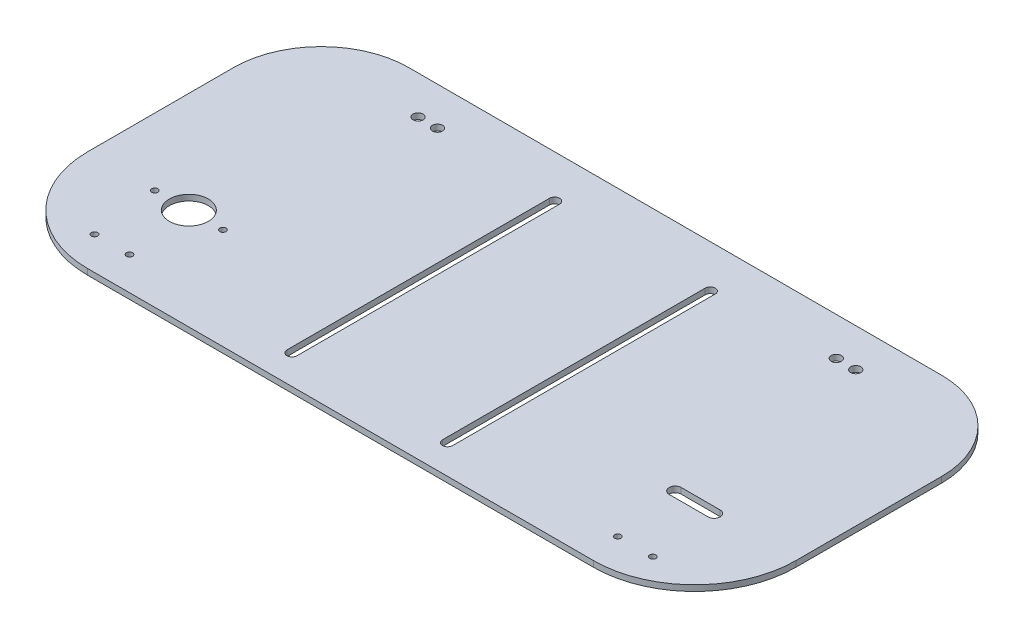
ISO-10303-21;
HEADER;
FILE_DESCRIPTION(('STEP AP214'),'2;1');
FILE_NAME('part.step','',(''),(''),'','','');
FILE_SCHEMA(('AUTOMOTIVE_DESIGN { 1 0 10303 214 1 1 1 1 }'));
ENDSEC;
DATA;
#1=APPLICATION_CONTEXT('core data for automotive mechanical design processes');
#2=APPLICATION_PROTOCOL_DEFINITION('international standard','automotive_design',2000,#1);
#3=PRODUCT_CONTEXT('',#1,'mechanical');
#4=PRODUCT('Part','Part','',(#3));
#5=PRODUCT_RELATED_PRODUCT_CATEGORY('part','',(#4));
#6=PRODUCT_DEFINITION_FORMATION('','',#4);
#7=PRODUCT_DEFINITION_CONTEXT('part definition',#1,'design');
#8=PRODUCT_DEFINITION('design','',#6,#7);
#9=PRODUCT_DEFINITION_SHAPE('','',#8);
#10=(LENGTH_UNIT() NAMED_UNIT(*) SI_UNIT(.MILLI.,.METRE.));
#11=(NAMED_UNIT(*) PLANE_ANGLE_UNIT() SI_UNIT($,.RADIAN.));
#12=(NAMED_UNIT(*) SI_UNIT($,.STERADIAN.) SOLID_ANGLE_UNIT());
#13=UNCERTAINTY_MEASURE_WITH_UNIT(LENGTH_MEASURE(1.E-05),#10,'distance_accuracy_value','');
#14=(GEOMETRIC_REPRESENTATION_CONTEXT(3) GLOBAL_UNCERTAINTY_ASSIGNED_CONTEXT((#13)) GLOBAL_UNIT_ASSIGNED_CONTEXT((#10,
#11,#12)) REPRESENTATION_CONTEXT('',''));
#15=CARTESIAN_POINT('',(0.,0.,0.));
#16=DIRECTION('',(0.,0.,1.));
#17=DIRECTION('',(1.,0.,0.));
#18=AXIS2_PLACEMENT_3D('',#15,#16,#17);
#19=CARTESIAN_POINT('',(250.,3.,0.));
#20=DIRECTION('',(0.,-1.,0.));
#21=DIRECTION('',(0.,0.,-1.));
#22=AXIS2_PLACEMENT_3D('',#19,#20,#21);
#23=CYLINDRICAL_SURFACE('',#22,3.1);
#24=CARTESIAN_POINT('',(250.,0.,0.));
#25=DIRECTION('',(0.,1.,0.));
#26=DIRECTION('',(0.,0.,1.));
#27=AXIS2_PLACEMENT_3D('',#24,#25,#26);
#28=CIRCLE('',#27,3.1);
#29=CARTESIAN_POINT('',(250.,0.,-3.10000000000003));
#30=VERTEX_POINT('',#29);
#31=CARTESIAN_POINT('',(250.,0.,3.09999999999997));
#32=VERTEX_POINT('',#31);
#33=EDGE_CURVE('E348',#30,#32,#28,.T.);
#34=ORIENTED_EDGE('',*,*,#33,.F.);
#35=DIRECTION('',(0.,-1.,0.));
#36=VECTOR('',#35,1.);
#37=CARTESIAN_POINT('',(250.,3.,-3.10000000000003));
#38=LINE('',#37,#36);
#39=CARTESIAN_POINT('',(250.,3.,-3.10000000000003));
#40=VERTEX_POINT('',#39);
#41=EDGE_CURVE('E373',#40,#30,#38,.T.);
#42=ORIENTED_EDGE('',*,*,#41,.F.);
#43=CARTESIAN_POINT('',(250.,3.,0.));
#44=DIRECTION('',(0.,1.,0.));
#45=DIRECTION('',(0.,0.,1.));
#46=AXIS2_PLACEMENT_3D('',#43,#44,#45);
#47=CIRCLE('',#46,3.1);
#48=CARTESIAN_POINT('',(250.,3.,3.09999999999997));
#49=VERTEX_POINT('',#48);
#50=EDGE_CURVE('E312',#40,#49,#47,.T.);
#51=ORIENTED_EDGE('',*,*,#50,.T.);
#52=DIRECTION('',(0.,-1.,0.));
#53=VECTOR('',#52,1.);
#54=CARTESIAN_POINT('',(250.,3.,3.09999999999997));
#55=LINE('',#54,#53);
#56=EDGE_CURVE('E363',#49,#32,#55,.T.);
#57=ORIENTED_EDGE('',*,*,#56,.T.);
#58=EDGE_LOOP('',(#34,#42,#51,#57));
#59=FACE_BOUND('',#58,.T.);
#60=ADVANCED_FACE('F46',(#59),#23,.F.);
#61=CARTESIAN_POINT('',(0.,3.,-3.10000000000003));
#62=DIRECTION('',(0.,0.,1.));
#63=DIRECTION('',(1.,0.,0.));
#64=AXIS2_PLACEMENT_3D('',#61,#62,#63);
#65=PLANE('',#64);
#66=DIRECTION('',(-1.,0.,0.));
#67=VECTOR('',#66,1.);
#68=CARTESIAN_POINT('',(0.,0.,-3.10000000000003));
#69=LINE('',#68,#67);
#70=CARTESIAN_POINT('',(270.,0.,-3.10000000000003));
#71=VERTEX_POINT('',#70);
#72=EDGE_CURVE('E352',#71,#30,#69,.T.);
#73=ORIENTED_EDGE('',*,*,#72,.F.);
#74=DIRECTION('',(0.,-1.,0.));
#75=VECTOR('',#74,1.);
#76=CARTESIAN_POINT('',(270.,3.,-3.10000000000003));
#77=LINE('',#76,#75);
#78=CARTESIAN_POINT('',(270.,3.,-3.10000000000003));
#79=VERTEX_POINT('',#78);
#80=EDGE_CURVE('E370',#79,#71,#77,.T.);
#81=ORIENTED_EDGE('',*,*,#80,.F.);
#82=DIRECTION('',(-1.,0.,0.));
#83=VECTOR('',#82,1.);
#84=CARTESIAN_POINT('',(0.,3.,-3.10000000000003));
#85=LINE('',#84,#83);
#86=EDGE_CURVE('E316',#79,#40,#85,.T.);
#87=ORIENTED_EDGE('',*,*,#86,.T.);
#88=ORIENTED_EDGE('',*,*,#41,.T.);
#89=EDGE_LOOP('',(#73,#81,#87,#88));
#90=FACE_BOUND('',#89,.T.);
#91=ADVANCED_FACE('F449',(#90),#65,.T.);
#92=CARTESIAN_POINT('',(270.,3.,0.));
#93=DIRECTION('',(0.,-1.,0.));
#94=DIRECTION('',(0.,0.,-1.));
#95=AXIS2_PLACEMENT_3D('',#92,#93,#94);
#96=CYLINDRICAL_SURFACE('',#95,3.1);
#97=CARTESIAN_POINT('',(270.,0.,0.));
#98=DIRECTION('',(0.,1.,0.));
#99=DIRECTION('',(0.,0.,1.));
#100=AXIS2_PLACEMENT_3D('',#97,#98,#99);
#101=CIRCLE('',#100,3.1);
#102=CARTESIAN_POINT('',(270.,0.,3.09999999999997));
#103=VERTEX_POINT('',#102);
#104=EDGE_CURVE('E356',#103,#71,#101,.T.);
#105=ORIENTED_EDGE('',*,*,#104,.F.);
#106=DIRECTION('',(0.,-1.,0.));
#107=VECTOR('',#106,1.);
#108=CARTESIAN_POINT('',(270.,3.,3.09999999999997));
#109=LINE('',#108,#107);
#110=CARTESIAN_POINT('',(270.,3.,3.09999999999997));
#111=VERTEX_POINT('',#110);
#112=EDGE_CURVE('E366',#111,#103,#109,.T.);
#113=ORIENTED_EDGE('',*,*,#112,.F.);
#114=CARTESIAN_POINT('',(270.,3.,0.));
#115=DIRECTION('',(0.,1.,0.));
#116=DIRECTION('',(0.,0.,1.));
#117=AXIS2_PLACEMENT_3D('',#114,#115,#116);
#118=CIRCLE('',#117,3.1);
#119=EDGE_CURVE('E320',#111,#79,#118,.T.);
#120=ORIENTED_EDGE('',*,*,#119,.T.);
#121=ORIENTED_EDGE('',*,*,#80,.T.);
#122=EDGE_LOOP('',(#105,#113,#120,#121));
#123=FACE_BOUND('',#122,.T.);
#124=ADVANCED_FACE('F455',(#123),#96,.F.);
#125=CARTESIAN_POINT('',(260.,3.,0.));
#126=DIRECTION('',(0.,-1.,0.));
#127=DIRECTION('',(0.,0.,-1.));
#128=AXIS2_PLACEMENT_3D('',#125,#126,#127);
#129=CYLINDRICAL_SURFACE('',#128,52.);
#130=CARTESIAN_POINT('',(260.,0.,0.));
#131=DIRECTION('',(0.,1.,0.));
#132=DIRECTION('',(0.,0.,1.));
#133=AXIS2_PLACEMENT_3D('',#130,#131,#132);
#134=CIRCLE('',#133,52.);
#135=CARTESIAN_POINT('',(260.,0.,52.));
#136=VERTEX_POINT('',#135);
#137=CARTESIAN_POINT('',(312.,0.,0.));
#138=VERTEX_POINT('',#137);
#139=EDGE_CURVE('E241',#136,#138,#134,.T.);
#140=ORIENTED_EDGE('',*,*,#139,.T.);
#141=DIRECTION('',(0.,-1.,0.));
#142=VECTOR('',#141,1.);
#143=CARTESIAN_POINT('',(312.,3.,0.));
#144=LINE('',#143,#142);
#145=CARTESIAN_POINT('',(312.,3.,0.));
#146=VERTEX_POINT('',#145);
#147=EDGE_CURVE('E367',#146,#138,#144,.T.);
#148=ORIENTED_EDGE('',*,*,#147,.F.);
#149=CARTESIAN_POINT('',(260.,3.,0.));
#150=DIRECTION('',(0.,1.,0.));
#151=DIRECTION('',(0.,0.,1.));
#152=AXIS2_PLACEMENT_3D('',#149,#150,#151);
#153=CIRCLE('',#152,52.);
#154=CARTESIAN_POINT('',(260.,3.,52.));
#155=VERTEX_POINT('',#154);
#156=EDGE_CURVE('E291',#155,#146,#153,.T.);
#157=ORIENTED_EDGE('',*,*,#156,.F.);
#158=DIRECTION('',(0.,-1.,0.));
#159=VECTOR('',#158,1.);
#160=CARTESIAN_POINT('',(260.,3.,52.));
#161=LINE('',#160,#159);
#162=EDGE_CURVE('E327',#155,#136,#161,.T.);
#163=ORIENTED_EDGE('',*,*,#162,.T.);
#164=EDGE_LOOP('',(#140,#148,#157,#163));
#165=FACE_BOUND('',#164,.T.);
#166=ADVANCED_FACE('F423',(#165),#129,.T.);
#167=CARTESIAN_POINT('',(312.,3.,0.));
#168=DIRECTION('',(-1.,0.,0.));
#169=DIRECTION('',(0.,0.,1.));
#170=AXIS2_PLACEMENT_3D('',#167,#168,#169);
#171=PLANE('',#170);
#172=DIRECTION('',(0.,0.,-1.));
#173=VECTOR('',#172,1.);
#174=CARTESIAN_POINT('',(312.,0.,0.));
#175=LINE('',#174,#173);
#176=CARTESIAN_POINT('',(312.,0.,-75.));
#177=VERTEX_POINT('',#176);
#178=EDGE_CURVE('E331',#138,#177,#175,.T.);
#179=ORIENTED_EDGE('',*,*,#178,.T.);
#180=DIRECTION('',(0.,-1.,0.));
#181=VECTOR('',#180,1.);
#182=CARTESIAN_POINT('',(312.,3.,-75.));
#183=LINE('',#182,#181);
#184=CARTESIAN_POINT('',(312.,3.,-75.));
#185=VERTEX_POINT('',#184);
#186=EDGE_CURVE('E70',#177,#185,#183,.F.);
#187=ORIENTED_EDGE('',*,*,#186,.T.);
#188=DIRECTION('',(0.,0.,-1.));
#189=VECTOR('',#188,1.);
#190=CARTESIAN_POINT('',(312.,3.,0.));
#191=LINE('',#190,#189);
#192=EDGE_CURVE('E295',#146,#185,#191,.T.);
#193=ORIENTED_EDGE('',*,*,#192,.F.);
#194=ORIENTED_EDGE('',*,*,#147,.T.);
#195=EDGE_LOOP('',(#179,#187,#193,#194));
#196=FACE_BOUND('',#195,.T.);
#197=ADVANCED_FACE('F419',(#196),#171,.F.);
#198=CARTESIAN_POINT('',(0.,3.,-120.));
#199=DIRECTION('',(0.,0.,-1.));
#200=DIRECTION('',(-1.,0.,0.));
#201=AXIS2_PLACEMENT_3D('',#198,#199,#200);
#202=PLANE('',#201);
#203=DIRECTION('',(1.,0.,0.));
#204=VECTOR('',#203,1.);
#205=CARTESIAN_POINT('',(0.,3.,-120.));
#206=LINE('',#205,#204);
#207=CARTESIAN_POINT('',(-7.,3.,-120.));
#208=VERTEX_POINT('',#207);
#209=CARTESIAN_POINT('',(267.,3.,-120.));
#210=VERTEX_POINT('',#209);
#211=EDGE_CURVE('E299',#208,#210,#206,.T.);
#212=ORIENTED_EDGE('',*,*,#211,.T.);
#213=DIRECTION('',(0.,-1.,0.));
#214=VECTOR('',#213,1.);
#215=CARTESIAN_POINT('',(267.,0.,-120.));
#216=LINE('',#215,#214);
#217=CARTESIAN_POINT('',(267.,0.,-120.));
#218=VERTEX_POINT('',#217);
#219=EDGE_CURVE('E392',#210,#218,#216,.T.);
#220=ORIENTED_EDGE('',*,*,#219,.T.);
#221=DIRECTION('',(1.,0.,0.));
#222=VECTOR('',#221,1.);
#223=CARTESIAN_POINT('',(0.,0.,-120.));
#224=LINE('',#223,#222);
#225=CARTESIAN_POINT('',(-7.,0.,-120.));
#226=VERTEX_POINT('',#225);
#227=EDGE_CURVE('E334',#226,#218,#224,.T.);
#228=ORIENTED_EDGE('',*,*,#227,.F.);
#229=DIRECTION('',(0.,-1.,0.));
#230=VECTOR('',#229,1.);
#231=CARTESIAN_POINT('',(-7.,3.,-120.));
#232=LINE('',#231,#230);
#233=EDGE_CURVE('E376',#226,#208,#232,.F.);
#234=ORIENTED_EDGE('',*,*,#233,.T.);
#235=EDGE_LOOP('',(#212,#220,#228,#234));
#236=FACE_BOUND('',#235,.T.);
#237=ADVANCED_FACE('F412',(#236),#202,.T.);
#238=CARTESIAN_POINT('',(-52.,3.,0.));
#239=DIRECTION('',(-1.,0.,0.));
#240=DIRECTION('',(0.,0.,1.));
#241=AXIS2_PLACEMENT_3D('',#238,#239,#240);
#242=PLANE('',#241);
#243=DIRECTION('',(0.,0.,-1.));
#244=VECTOR('',#243,1.);
#245=CARTESIAN_POINT('',(-52.,3.,0.));
#246=LINE('',#245,#244);
#247=CARTESIAN_POINT('',(-52.,3.,0.));
#248=VERTEX_POINT('',#247);
#249=CARTESIAN_POINT('',(-52.,3.,-75.));
#250=VERTEX_POINT('',#249);
#251=EDGE_CURVE('E303',#248,#250,#246,.T.);
#252=ORIENTED_EDGE('',*,*,#251,.T.);
#253=DIRECTION('',(0.,-1.,0.));
#254=VECTOR('',#253,1.);
#255=CARTESIAN_POINT('',(-52.,3.,-75.));
#256=LINE('',#255,#254);
#257=CARTESIAN_POINT('',(-52.,0.,-75.));
#258=VERTEX_POINT('',#257);
#259=EDGE_CURVE('E11',#250,#258,#256,.T.);
#260=ORIENTED_EDGE('',*,*,#259,.T.);
#261=DIRECTION('',(0.,0.,-1.));
#262=VECTOR('',#261,1.);
#263=CARTESIAN_POINT('',(-52.,0.,0.));
#264=LINE('',#263,#262);
#265=CARTESIAN_POINT('',(-52.,0.,0.));
#266=VERTEX_POINT('',#265);
#267=EDGE_CURVE('E338',#266,#258,#264,.T.);
#268=ORIENTED_EDGE('',*,*,#267,.F.);
#269=DIRECTION('',(0.,-1.,0.));
#270=VECTOR('',#269,1.);
#271=CARTESIAN_POINT('',(-52.,3.,0.));
#272=LINE('',#271,#270);
#273=EDGE_CURVE('E384',#248,#266,#272,.T.);
#274=ORIENTED_EDGE('',*,*,#273,.F.);
#275=EDGE_LOOP('',(#252,#260,#268,#274));
#276=FACE_BOUND('',#275,.T.);
#277=ADVANCED_FACE('F436',(#276),#242,.T.);
#278=CARTESIAN_POINT('',(0.,3.,0.));
#279=DIRECTION('',(0.,-1.,0.));
#280=DIRECTION('',(0.,0.,-1.));
#281=AXIS2_PLACEMENT_3D('',#278,#279,#280);
#282=CYLINDRICAL_SURFACE('',#281,52.);
#283=CARTESIAN_POINT('',(0.,0.,0.));
#284=DIRECTION('',(0.,1.,0.));
#285=DIRECTION('',(0.,0.,1.));
#286=AXIS2_PLACEMENT_3D('',#283,#284,#285);
#287=CIRCLE('',#286,52.);
#288=CARTESIAN_POINT('',(0.,0.,52.));
#289=VERTEX_POINT('',#288);
#290=EDGE_CURVE('E342',#266,#289,#287,.T.);
#291=ORIENTED_EDGE('',*,*,#290,.T.);
#292=DIRECTION('',(0.,-1.,0.));
#293=VECTOR('',#292,1.);
#294=CARTESIAN_POINT('',(0.,3.,52.));
#295=LINE('',#294,#293);
#296=CARTESIAN_POINT('',(0.,3.,52.));
#297=VERTEX_POINT('',#296);
#298=EDGE_CURVE('E380',#297,#289,#295,.T.);
#299=ORIENTED_EDGE('',*,*,#298,.F.);
#300=CARTESIAN_POINT('',(0.,3.,0.));
#301=DIRECTION('',(0.,1.,0.));
#302=DIRECTION('',(0.,0.,1.));
#303=AXIS2_PLACEMENT_3D('',#300,#301,#302);
#304=CIRCLE('',#303,52.);
#305=EDGE_CURVE('E306',#248,#297,#304,.T.);
#306=ORIENTED_EDGE('',*,*,#305,.F.);
#307=ORIENTED_EDGE('',*,*,#273,.T.);
#308=EDGE_LOOP('',(#291,#299,#306,#307));
#309=FACE_BOUND('',#308,.T.);
#310=ADVANCED_FACE('F434',(#309),#282,.T.);
#311=CARTESIAN_POINT('',(0.,3.,3.09999999999997));
#312=DIRECTION('',(0.,0.,1.));
#313=DIRECTION('',(1.,0.,0.));
#314=AXIS2_PLACEMENT_3D('',#311,#312,#313);
#315=PLANE('',#314);
#316=DIRECTION('',(-1.,0.,0.));
#317=VECTOR('',#316,1.);
#318=CARTESIAN_POINT('',(0.,0.,3.09999999999997));
#319=LINE('',#318,#317);
#320=EDGE_CURVE('E296',#103,#32,#319,.T.);
#321=ORIENTED_EDGE('',*,*,#320,.T.);
#322=ORIENTED_EDGE('',*,*,#56,.F.);
#323=DIRECTION('',(-1.,0.,0.));
#324=VECTOR('',#323,1.);
#325=CARTESIAN_POINT('',(0.,3.,3.09999999999997));
#326=LINE('',#325,#324);
#327=EDGE_CURVE('E324',#111,#49,#326,.T.);
#328=ORIENTED_EDGE('',*,*,#327,.F.);
#329=ORIENTED_EDGE('',*,*,#112,.T.);
#330=EDGE_LOOP('',(#321,#322,#328,#329));
#331=FACE_BOUND('',#330,.T.);
#332=ADVANCED_FACE('F463',(#331),#315,.F.);
#333=CARTESIAN_POINT('',(0.,3.,52.));
#334=DIRECTION('',(0.,0.,-1.));
#335=DIRECTION('',(-1.,0.,0.));
#336=AXIS2_PLACEMENT_3D('',#333,#334,#335);
#337=PLANE('',#336);
#338=DIRECTION('',(1.,0.,0.));
#339=VECTOR('',#338,1.);
#340=CARTESIAN_POINT('',(0.,0.,52.));
#341=LINE('',#340,#339);
#342=EDGE_CURVE('E345',#289,#136,#341,.T.);
#343=ORIENTED_EDGE('',*,*,#342,.T.);
#344=ORIENTED_EDGE('',*,*,#162,.F.);
#345=DIRECTION('',(1.,0.,0.));
#346=VECTOR('',#345,1.);
#347=CARTESIAN_POINT('',(0.,3.,52.));
#348=LINE('',#347,#346);
#349=EDGE_CURVE('E309',#297,#155,#348,.T.);
#350=ORIENTED_EDGE('',*,*,#349,.F.);
#351=ORIENTED_EDGE('',*,*,#298,.T.);
#352=EDGE_LOOP('',(#343,#344,#350,#351));
#353=FACE_BOUND('',#352,.T.);
#354=ADVANCED_FACE('F429',(#353),#337,.F.);
#355=CARTESIAN_POINT('',(0.,3.,0.));
#356=DIRECTION('',(0.,1.,0.));
#357=DIRECTION('',(0.,0.,1.));
#358=AXIS2_PLACEMENT_3D('',#355,#356,#357);
#359=PLANE('',#358);
#360=CARTESIAN_POINT('',(-13.4999999999999,3.,34.9999999999993));
#361=DIRECTION('',(0.,1.,0.));
#362=DIRECTION('',(0.,0.,1.));
#363=AXIS2_PLACEMENT_3D('',#360,#361,#362);
#364=CIRCLE('',#363,1.6);
#365=CARTESIAN_POINT('',(-13.4999999999999,3.,36.5999999999993));
#366=VERTEX_POINT('',#365);
#367=EDGE_CURVE('E564',#366,#366,#364,.T.);
#368=ORIENTED_EDGE('',*,*,#367,.F.);
#369=EDGE_LOOP('',(#368));
#370=FACE_BOUND('',#369,.T.);
#371=CARTESIAN_POINT('',(4.50000000000015,3.,34.9999999999994));
#372=DIRECTION('',(0.,1.,0.));
#373=DIRECTION('',(0.,0.,1.));
#374=AXIS2_PLACEMENT_3D('',#371,#372,#373);
#375=CIRCLE('',#374,1.6);
#376=CARTESIAN_POINT('',(4.50000000000015,3.,36.5999999999994));
#377=VERTEX_POINT('',#376);
#378=EDGE_CURVE('E566',#377,#377,#375,.T.);
#379=ORIENTED_EDGE('',*,*,#378,.F.);
#380=EDGE_LOOP('',(#379));
#381=FACE_BOUND('',#380,.T.);
#382=CARTESIAN_POINT('',(255.5,3.,35.0000000000002));
#383=DIRECTION('',(0.,1.,0.));
#384=DIRECTION('',(0.,0.,1.));
#385=AXIS2_PLACEMENT_3D('',#382,#383,#384);
#386=CIRCLE('',#385,1.59999999999996);
#387=CARTESIAN_POINT('',(255.5,3.,36.6000000000001));
#388=VERTEX_POINT('',#387);
#389=EDGE_CURVE('E579',#388,#388,#386,.T.);
#390=ORIENTED_EDGE('',*,*,#389,.F.);
#391=EDGE_LOOP('',(#390));
#392=FACE_BOUND('',#391,.T.);
#393=CARTESIAN_POINT('',(273.5,3.,35.0000000000002));
#394=DIRECTION('',(0.,1.,0.));
#395=DIRECTION('',(0.,0.,1.));
#396=AXIS2_PLACEMENT_3D('',#393,#394,#395);
#397=CIRCLE('',#396,1.59999999999996);
#398=CARTESIAN_POINT('',(273.5,3.,36.6000000000002));
#399=VERTEX_POINT('',#398);
#400=EDGE_CURVE('E587',#399,#399,#397,.T.);
#401=ORIENTED_EDGE('',*,*,#400,.F.);
#402=EDGE_LOOP('',(#401));
#403=FACE_BOUND('',#402,.T.);
#404=CARTESIAN_POINT('',(-17.5,3.,0.));
#405=DIRECTION('',(0.,1.,0.));
#406=DIRECTION('',(0.,0.,1.));
#407=AXIS2_PLACEMENT_3D('',#404,#405,#406);
#408=CIRCLE('',#407,1.6);
#409=CARTESIAN_POINT('',(-17.5,3.,1.6));
#410=VERTEX_POINT('',#409);
#411=EDGE_CURVE('E600',#410,#410,#408,.T.);
#412=ORIENTED_EDGE('',*,*,#411,.F.);
#413=EDGE_LOOP('',(#412));
#414=FACE_BOUND('',#413,.T.);
#415=CARTESIAN_POINT('',(17.5,3.,0.));
#416=DIRECTION('',(0.,1.,0.));
#417=DIRECTION('',(0.,0.,1.));
#418=AXIS2_PLACEMENT_3D('',#415,#416,#417);
#419=CIRCLE('',#418,1.6);
#420=CARTESIAN_POINT('',(17.5,3.,1.6));
#421=VERTEX_POINT('',#420);
#422=EDGE_CURVE('E604',#421,#421,#419,.T.);
#423=ORIENTED_EDGE('',*,*,#422,.F.);
#424=EDGE_LOOP('',(#423));
#425=FACE_BOUND('',#424,.T.);
#426=CARTESIAN_POINT('',(17.3999999999766,3.,-100.399999999992));
#427=DIRECTION('',(0.,-1.,0.));
#428=DIRECTION('',(0.,0.,-1.));
#429=AXIS2_PLACEMENT_3D('',#426,#427,#428);
#430=CIRCLE('',#429,2.60000000000293);
#431=CARTESIAN_POINT('',(17.3999999999766,3.,-102.999999999995));
#432=VERTEX_POINT('',#431);
#433=EDGE_CURVE('E611',#432,#432,#430,.T.);
#434=ORIENTED_EDGE('',*,*,#433,.T.);
#435=EDGE_LOOP('',(#434));
#436=FACE_BOUND('',#435,.T.);
#437=CARTESIAN_POINT('',(27.3999999999766,3.,-100.399999999992));
#438=DIRECTION('',(0.,-1.,0.));
#439=DIRECTION('',(0.,0.,-1.));
#440=AXIS2_PLACEMENT_3D('',#437,#438,#439);
#441=CIRCLE('',#440,2.60000000000293);
#442=CARTESIAN_POINT('',(27.3999999999766,3.,-102.999999999995));
#443=VERTEX_POINT('',#442);
#444=EDGE_CURVE('E623',#443,#443,#441,.T.);
#445=ORIENTED_EDGE('',*,*,#444,.T.);
#446=EDGE_LOOP('',(#445));
#447=FACE_BOUND('',#446,.T.);
#448=CARTESIAN_POINT('',(232.399999999982,3.,-100.4));
#449=DIRECTION('',(0.,-1.,0.));
#450=DIRECTION('',(0.,0.,-1.));
#451=AXIS2_PLACEMENT_3D('',#448,#449,#450);
#452=CIRCLE('',#451,2.60000000001803);
#453=CARTESIAN_POINT('',(232.399999999982,3.,-103.000000000018));
#454=VERTEX_POINT('',#453);
#455=EDGE_CURVE('E631',#454,#454,#452,.T.);
#456=ORIENTED_EDGE('',*,*,#455,.T.);
#457=EDGE_LOOP('',(#456));
#458=FACE_BOUND('',#457,.T.);
#459=CARTESIAN_POINT('',(242.399999999982,3.,-100.4));
#460=DIRECTION('',(0.,-1.,0.));
#461=DIRECTION('',(0.,0.,-1.));
#462=AXIS2_PLACEMENT_3D('',#459,#460,#461);
#463=CIRCLE('',#462,2.60000000001802);
#464=CARTESIAN_POINT('',(242.399999999982,3.,-103.000000000018));
#465=VERTEX_POINT('',#464);
#466=EDGE_CURVE('E599',#465,#465,#463,.T.);
#467=ORIENTED_EDGE('',*,*,#466,.T.);
#468=EDGE_LOOP('',(#467));
#469=FACE_BOUND('',#468,.T.);
#470=CARTESIAN_POINT('',(0.,3.,0.));
#471=DIRECTION('',(0.,1.,0.));
#472=DIRECTION('',(0.,0.,1.));
#473=AXIS2_PLACEMENT_3D('',#470,#471,#472);
#474=CIRCLE('',#473,10.);
#475=CARTESIAN_POINT('',(0.,3.,10.));
#476=VERTEX_POINT('',#475);
#477=EDGE_CURVE('E222',#476,#476,#474,.T.);
#478=ORIENTED_EDGE('',*,*,#477,.F.);
#479=EDGE_LOOP('',(#478));
#480=FACE_BOUND('',#479,.T.);
#481=CARTESIAN_POINT('',(90.,3.,37.));
#482=DIRECTION('',(0.,1.,0.));
#483=DIRECTION('',(0.,0.,1.));
#484=AXIS2_PLACEMENT_3D('',#481,#482,#483);
#485=CIRCLE('',#484,2.59999999999996);
#486=CARTESIAN_POINT('',(87.4,3.,37.));
#487=VERTEX_POINT('',#486);
#488=CARTESIAN_POINT('',(92.6,3.,37.));
#489=VERTEX_POINT('',#488);
#490=EDGE_CURVE('E194',#487,#489,#485,.T.);
#491=ORIENTED_EDGE('',*,*,#490,.F.);
#492=DIRECTION('',(0.,0.,1.));
#493=VECTOR('',#492,1.);
#494=CARTESIAN_POINT('',(87.4,3.,37.));
#495=LINE('',#494,#493);
#496=CARTESIAN_POINT('',(87.4,3.,-98.));
#497=VERTEX_POINT('',#496);
#498=EDGE_CURVE('E215',#497,#487,#495,.T.);
#499=ORIENTED_EDGE('',*,*,#498,.F.);
#500=CARTESIAN_POINT('',(90.,3.,-98.));
#501=DIRECTION('',(0.,1.,0.));
#502=DIRECTION('',(0.,0.,1.));
#503=AXIS2_PLACEMENT_3D('',#500,#501,#502);
#504=CIRCLE('',#503,2.59999999999999);
#505=CARTESIAN_POINT('',(92.6,3.,-98.));
#506=VERTEX_POINT('',#505);
#507=EDGE_CURVE('E219',#506,#497,#504,.T.);
#508=ORIENTED_EDGE('',*,*,#507,.F.);
#509=DIRECTION('',(0.,0.,-1.));
#510=VECTOR('',#509,1.);
#511=CARTESIAN_POINT('',(92.6,3.,37.));
#512=LINE('',#511,#510);
#513=EDGE_CURVE('E231',#489,#506,#512,.T.);
#514=ORIENTED_EDGE('',*,*,#513,.F.);
#515=EDGE_LOOP('',(#491,#499,#508,#514));
#516=FACE_BOUND('',#515,.T.);
#517=CARTESIAN_POINT('',(170.,3.,37.));
#518=DIRECTION('',(0.,1.,0.));
#519=DIRECTION('',(0.,0.,-1.));
#520=AXIS2_PLACEMENT_3D('',#517,#518,#519);
#521=CIRCLE('',#520,2.59999999999996);
#522=CARTESIAN_POINT('',(167.4,3.,37.));
#523=VERTEX_POINT('',#522);
#524=CARTESIAN_POINT('',(172.6,3.,37.));
#525=VERTEX_POINT('',#524);
#526=EDGE_CURVE('E232',#523,#525,#521,.T.);
#527=ORIENTED_EDGE('',*,*,#526,.F.);
#528=DIRECTION('',(0.,0.,1.));
#529=VECTOR('',#528,1.);
#530=CARTESIAN_POINT('',(167.4,3.,37.));
#531=LINE('',#530,#529);
#532=CARTESIAN_POINT('',(167.4,3.,-98.));
#533=VERTEX_POINT('',#532);
#534=EDGE_CURVE('E262',#533,#523,#531,.T.);
#535=ORIENTED_EDGE('',*,*,#534,.F.);
#536=CARTESIAN_POINT('',(170.,3.,-98.));
#537=DIRECTION('',(0.,1.,0.));
#538=DIRECTION('',(0.,0.,-1.));
#539=AXIS2_PLACEMENT_3D('',#536,#537,#538);
#540=CIRCLE('',#539,2.59999999999999);
#541=CARTESIAN_POINT('',(172.6,3.,-98.));
#542=VERTEX_POINT('',#541);
#543=EDGE_CURVE('E266',#542,#533,#540,.T.);
#544=ORIENTED_EDGE('',*,*,#543,.F.);
#545=DIRECTION('',(0.,0.,-1.));
#546=VECTOR('',#545,1.);
#547=CARTESIAN_POINT('',(172.6,3.,37.));
#548=LINE('',#547,#546);
#549=EDGE_CURVE('E271',#525,#542,#548,.T.);
#550=ORIENTED_EDGE('',*,*,#549,.F.);
#551=EDGE_LOOP('',(#527,#535,#544,#550));
#552=FACE_BOUND('',#551,.T.);
#553=ORIENTED_EDGE('',*,*,#192,.T.);
#554=CARTESIAN_POINT('',(267.,3.,-75.));
#555=DIRECTION('',(0.,1.,0.));
#556=DIRECTION('',(0.,0.,1.));
#557=AXIS2_PLACEMENT_3D('',#554,#555,#556);
#558=CIRCLE('',#557,45.);
#559=EDGE_CURVE('E55',#185,#210,#558,.T.);
#560=ORIENTED_EDGE('',*,*,#559,.T.);
#561=ORIENTED_EDGE('',*,*,#211,.F.);
#562=CARTESIAN_POINT('',(-7.,3.,-75.));
#563=DIRECTION('',(0.,1.,0.));
#564=DIRECTION('',(0.,0.,1.));
#565=AXIS2_PLACEMENT_3D('',#562,#563,#564);
#566=CIRCLE('',#565,45.);
#567=EDGE_CURVE('E62',#208,#250,#566,.T.);
#568=ORIENTED_EDGE('',*,*,#567,.T.);
#569=ORIENTED_EDGE('',*,*,#251,.F.);
#570=ORIENTED_EDGE('',*,*,#305,.T.);
#571=ORIENTED_EDGE('',*,*,#349,.T.);
#572=ORIENTED_EDGE('',*,*,#156,.T.);
#573=EDGE_LOOP('',(#553,#560,#561,#568,#569,#570,#571,#572));
#574=FACE_BOUND('',#573,.T.);
#575=ORIENTED_EDGE('',*,*,#50,.F.);
#576=ORIENTED_EDGE('',*,*,#86,.F.);
#577=ORIENTED_EDGE('',*,*,#119,.F.);
#578=ORIENTED_EDGE('',*,*,#327,.T.);
#579=EDGE_LOOP('',(#575,#576,#577,#578));
#580=FACE_BOUND('',#579,.T.);
#581=ADVANCED_FACE('F407',(#370,#381,#392,#403,#414,#425,#436,#447,#458,#469,#480,#516,#552,
#574,#580),#359,.T.);
#582=CARTESIAN_POINT('',(0.,0.,0.));
#583=DIRECTION('',(0.,1.,0.));
#584=DIRECTION('',(0.,0.,1.));
#585=AXIS2_PLACEMENT_3D('',#582,#583,#584);
#586=PLANE('',#585);
#587=CARTESIAN_POINT('',(-13.4999999999999,0.,34.9999999999993));
#588=DIRECTION('',(0.,1.,0.));
#589=DIRECTION('',(0.,0.,1.));
#590=AXIS2_PLACEMENT_3D('',#587,#588,#589);
#591=CIRCLE('',#590,1.6);
#592=CARTESIAN_POINT('',(-13.4999999999999,0.,36.5999999999993));
#593=VERTEX_POINT('',#592);
#594=EDGE_CURVE('E561',#593,#593,#591,.T.);
#595=ORIENTED_EDGE('',*,*,#594,.T.);
#596=EDGE_LOOP('',(#595));
#597=FACE_BOUND('',#596,.T.);
#598=CARTESIAN_POINT('',(4.50000000000015,0.,34.9999999999994));
#599=DIRECTION('',(0.,1.,0.));
#600=DIRECTION('',(0.,0.,1.));
#601=AXIS2_PLACEMENT_3D('',#598,#599,#600);
#602=CIRCLE('',#601,1.6);
#603=CARTESIAN_POINT('',(4.50000000000015,0.,36.5999999999994));
#604=VERTEX_POINT('',#603);
#605=EDGE_CURVE('E573',#604,#604,#602,.T.);
#606=ORIENTED_EDGE('',*,*,#605,.T.);
#607=EDGE_LOOP('',(#606));
#608=FACE_BOUND('',#607,.T.);
#609=CARTESIAN_POINT('',(255.5,0.,35.0000000000002));
#610=DIRECTION('',(0.,1.,0.));
#611=DIRECTION('',(0.,0.,1.));
#612=AXIS2_PLACEMENT_3D('',#609,#610,#611);
#613=CIRCLE('',#612,1.59999999999996);
#614=CARTESIAN_POINT('',(255.5,0.,36.6000000000001));
#615=VERTEX_POINT('',#614);
#616=EDGE_CURVE('E583',#615,#615,#613,.T.);
#617=ORIENTED_EDGE('',*,*,#616,.T.);
#618=EDGE_LOOP('',(#617));
#619=FACE_BOUND('',#618,.T.);
#620=CARTESIAN_POINT('',(273.5,0.,35.0000000000002));
#621=DIRECTION('',(0.,1.,0.));
#622=DIRECTION('',(0.,0.,1.));
#623=AXIS2_PLACEMENT_3D('',#620,#621,#622);
#624=CIRCLE('',#623,1.59999999999996);
#625=CARTESIAN_POINT('',(273.5,0.,36.6000000000002));
#626=VERTEX_POINT('',#625);
#627=EDGE_CURVE('E591',#626,#626,#624,.T.);
#628=ORIENTED_EDGE('',*,*,#627,.T.);
#629=EDGE_LOOP('',(#628));
#630=FACE_BOUND('',#629,.T.);
#631=CARTESIAN_POINT('',(-17.5,0.,0.));
#632=DIRECTION('',(0.,1.,0.));
#633=DIRECTION('',(0.,0.,1.));
#634=AXIS2_PLACEMENT_3D('',#631,#632,#633);
#635=CIRCLE('',#634,1.6);
#636=CARTESIAN_POINT('',(-17.5,0.,1.6));
#637=VERTEX_POINT('',#636);
#638=EDGE_CURVE('E595',#637,#637,#635,.T.);
#639=ORIENTED_EDGE('',*,*,#638,.T.);
#640=EDGE_LOOP('',(#639));
#641=FACE_BOUND('',#640,.T.);
#642=CARTESIAN_POINT('',(17.5,0.,0.));
#643=DIRECTION('',(0.,1.,0.));
#644=DIRECTION('',(0.,0.,1.));
#645=AXIS2_PLACEMENT_3D('',#642,#643,#644);
#646=CIRCLE('',#645,1.6);
#647=CARTESIAN_POINT('',(17.5,0.,1.6));
#648=VERTEX_POINT('',#647);
#649=EDGE_CURVE('E570',#648,#648,#646,.T.);
#650=ORIENTED_EDGE('',*,*,#649,.T.);
#651=EDGE_LOOP('',(#650));
#652=FACE_BOUND('',#651,.T.);
#653=CARTESIAN_POINT('',(17.3999999999766,0.,-100.399999999992));
#654=DIRECTION('',(0.,-1.,0.));
#655=DIRECTION('',(0.,0.,-1.));
#656=AXIS2_PLACEMENT_3D('',#653,#654,#655);
#657=CIRCLE('',#656,2.60000000000293);
#658=CARTESIAN_POINT('',(17.3999999999766,0.,-102.999999999995));
#659=VERTEX_POINT('',#658);
#660=EDGE_CURVE('E615',#659,#659,#657,.T.);
#661=ORIENTED_EDGE('',*,*,#660,.F.);
#662=EDGE_LOOP('',(#661));
#663=FACE_BOUND('',#662,.T.);
#664=CARTESIAN_POINT('',(27.3999999999766,0.,-100.399999999992));
#665=DIRECTION('',(0.,-1.,0.));
#666=DIRECTION('',(0.,0.,-1.));
#667=AXIS2_PLACEMENT_3D('',#664,#665,#666);
#668=CIRCLE('',#667,2.60000000000293);
#669=CARTESIAN_POINT('',(27.3999999999766,0.,-102.999999999995));
#670=VERTEX_POINT('',#669);
#671=EDGE_CURVE('E619',#670,#670,#668,.T.);
#672=ORIENTED_EDGE('',*,*,#671,.F.);
#673=EDGE_LOOP('',(#672));
#674=FACE_BOUND('',#673,.T.);
#675=CARTESIAN_POINT('',(232.399999999982,0.,-100.4));
#676=DIRECTION('',(0.,-1.,0.));
#677=DIRECTION('',(0.,0.,-1.));
#678=AXIS2_PLACEMENT_3D('',#675,#676,#677);
#679=CIRCLE('',#678,2.60000000001803);
#680=CARTESIAN_POINT('',(232.399999999982,0.,-103.000000000018));
#681=VERTEX_POINT('',#680);
#682=EDGE_CURVE('E627',#681,#681,#679,.T.);
#683=ORIENTED_EDGE('',*,*,#682,.F.);
#684=EDGE_LOOP('',(#683));
#685=FACE_BOUND('',#684,.T.);
#686=CARTESIAN_POINT('',(242.399999999982,0.,-100.4));
#687=DIRECTION('',(0.,-1.,0.));
#688=DIRECTION('',(0.,0.,-1.));
#689=AXIS2_PLACEMENT_3D('',#686,#687,#688);
#690=CIRCLE('',#689,2.60000000001802);
#691=CARTESIAN_POINT('',(242.399999999982,0.,-103.000000000018));
#692=VERTEX_POINT('',#691);
#693=EDGE_CURVE('E635',#692,#692,#690,.T.);
#694=ORIENTED_EDGE('',*,*,#693,.F.);
#695=EDGE_LOOP('',(#694));
#696=FACE_BOUND('',#695,.T.);
#697=CARTESIAN_POINT('',(0.,0.,0.));
#698=DIRECTION('',(0.,1.,0.));
#699=DIRECTION('',(0.,0.,1.));
#700=AXIS2_PLACEMENT_3D('',#697,#698,#699);
#701=CIRCLE('',#700,10.);
#702=CARTESIAN_POINT('',(0.,0.,10.));
#703=VERTEX_POINT('',#702);
#704=EDGE_CURVE('E261',#703,#703,#701,.T.);
#705=ORIENTED_EDGE('',*,*,#704,.T.);
#706=EDGE_LOOP('',(#705));
#707=FACE_BOUND('',#706,.T.);
#708=DIRECTION('',(0.,0.,1.));
#709=VECTOR('',#708,1.);
#710=CARTESIAN_POINT('',(87.4,0.,37.));
#711=LINE('',#710,#709);
#712=CARTESIAN_POINT('',(87.4,0.,-98.));
#713=VERTEX_POINT('',#712);
#714=CARTESIAN_POINT('',(87.4,0.,37.));
#715=VERTEX_POINT('',#714);
#716=EDGE_CURVE('E200',#713,#715,#711,.T.);
#717=ORIENTED_EDGE('',*,*,#716,.T.);
#718=CARTESIAN_POINT('',(90.,0.,37.));
#719=DIRECTION('',(0.,1.,0.));
#720=DIRECTION('',(0.,0.,1.));
#721=AXIS2_PLACEMENT_3D('',#718,#719,#720);
#722=CIRCLE('',#721,2.59999999999996);
#723=CARTESIAN_POINT('',(92.6,0.,37.));
#724=VERTEX_POINT('',#723);
#725=EDGE_CURVE('E191',#715,#724,#722,.T.);
#726=ORIENTED_EDGE('',*,*,#725,.T.);
#727=DIRECTION('',(0.,0.,-1.));
#728=VECTOR('',#727,1.);
#729=CARTESIAN_POINT('',(92.6,0.,37.));
#730=LINE('',#729,#728);
#731=CARTESIAN_POINT('',(92.6,0.,-98.));
#732=VERTEX_POINT('',#731);
#733=EDGE_CURVE('E204',#724,#732,#730,.T.);
#734=ORIENTED_EDGE('',*,*,#733,.T.);
#735=CARTESIAN_POINT('',(90.,0.,-98.));
#736=DIRECTION('',(0.,1.,0.));
#737=DIRECTION('',(0.,0.,1.));
#738=AXIS2_PLACEMENT_3D('',#735,#736,#737);
#739=CIRCLE('',#738,2.59999999999999);
#740=EDGE_CURVE('E209',#732,#713,#739,.T.);
#741=ORIENTED_EDGE('',*,*,#740,.T.);
#742=EDGE_LOOP('',(#717,#726,#734,#741));
#743=FACE_BOUND('',#742,.T.);
#744=DIRECTION('',(0.,0.,1.));
#745=VECTOR('',#744,1.);
#746=CARTESIAN_POINT('',(167.4,0.,37.));
#747=LINE('',#746,#745);
#748=CARTESIAN_POINT('',(167.4,0.,-98.));
#749=VERTEX_POINT('',#748);
#750=CARTESIAN_POINT('',(167.4,0.,37.));
#751=VERTEX_POINT('',#750);
#752=EDGE_CURVE('E251',#749,#751,#747,.T.);
#753=ORIENTED_EDGE('',*,*,#752,.T.);
#754=CARTESIAN_POINT('',(170.,0.,37.));
#755=DIRECTION('',(0.,1.,0.));
#756=DIRECTION('',(0.,0.,-1.));
#757=AXIS2_PLACEMENT_3D('',#754,#755,#756);
#758=CIRCLE('',#757,2.59999999999996);
#759=CARTESIAN_POINT('',(172.6,0.,37.));
#760=VERTEX_POINT('',#759);
#761=EDGE_CURVE('E267',#751,#760,#758,.T.);
#762=ORIENTED_EDGE('',*,*,#761,.T.);
#763=DIRECTION('',(0.,0.,-1.));
#764=VECTOR('',#763,1.);
#765=CARTESIAN_POINT('',(172.6,0.,37.));
#766=LINE('',#765,#764);
#767=CARTESIAN_POINT('',(172.6,0.,-98.));
#768=VERTEX_POINT('',#767);
#769=EDGE_CURVE('E284',#760,#768,#766,.T.);
#770=ORIENTED_EDGE('',*,*,#769,.T.);
#771=CARTESIAN_POINT('',(170.,0.,-98.));
#772=DIRECTION('',(0.,1.,0.));
#773=DIRECTION('',(0.,0.,-1.));
#774=AXIS2_PLACEMENT_3D('',#771,#772,#773);
#775=CIRCLE('',#774,2.59999999999999);
#776=EDGE_CURVE('E280',#768,#749,#775,.T.);
#777=ORIENTED_EDGE('',*,*,#776,.T.);
#778=EDGE_LOOP('',(#753,#762,#770,#777));
#779=FACE_BOUND('',#778,.T.);
#780=ORIENTED_EDGE('',*,*,#227,.T.);
#781=CARTESIAN_POINT('',(267.,0.,-75.));
#782=DIRECTION('',(0.,1.,0.));
#783=DIRECTION('',(0.,0.,1.));
#784=AXIS2_PLACEMENT_3D('',#781,#782,#783);
#785=CIRCLE('',#784,45.);
#786=EDGE_CURVE('E399',#218,#177,#785,.F.);
#787=ORIENTED_EDGE('',*,*,#786,.T.);
#788=ORIENTED_EDGE('',*,*,#178,.F.);
#789=ORIENTED_EDGE('',*,*,#139,.F.);
#790=ORIENTED_EDGE('',*,*,#342,.F.);
#791=ORIENTED_EDGE('',*,*,#290,.F.);
#792=ORIENTED_EDGE('',*,*,#267,.T.);
#793=CARTESIAN_POINT('',(-7.,0.,-75.));
#794=DIRECTION('',(0.,1.,0.));
#795=DIRECTION('',(0.,0.,1.));
#796=AXIS2_PLACEMENT_3D('',#793,#794,#795);
#797=CIRCLE('',#796,45.);
#798=EDGE_CURVE('E396',#258,#226,#797,.F.);
#799=ORIENTED_EDGE('',*,*,#798,.T.);
#800=EDGE_LOOP('',(#780,#787,#788,#789,#790,#791,#792,#799));
#801=FACE_BOUND('',#800,.T.);
#802=ORIENTED_EDGE('',*,*,#33,.T.);
#803=ORIENTED_EDGE('',*,*,#320,.F.);
#804=ORIENTED_EDGE('',*,*,#104,.T.);
#805=ORIENTED_EDGE('',*,*,#72,.T.);
#806=EDGE_LOOP('',(#802,#803,#804,#805));
#807=FACE_BOUND('',#806,.T.);
#808=ADVANCED_FACE('F211',(#597,#608,#619,#630,#641,#652,#663,#674,#685,#696,#707,#743,#779,
#801,#807),#586,.F.);
#809=CARTESIAN_POINT('',(170.,0.,37.));
#810=DIRECTION('',(0.,1.,0.));
#811=DIRECTION('',(0.,0.,1.));
#812=AXIS2_PLACEMENT_3D('',#809,#810,#811);
#813=CYLINDRICAL_SURFACE('',#812,2.59999999999996);
#814=ORIENTED_EDGE('',*,*,#526,.T.);
#815=DIRECTION('',(0.,1.,0.));
#816=VECTOR('',#815,1.);
#817=CARTESIAN_POINT('',(172.6,0.,37.));
#818=LINE('',#817,#816);
#819=EDGE_CURVE('E247',#760,#525,#818,.T.);
#820=ORIENTED_EDGE('',*,*,#819,.F.);
#821=ORIENTED_EDGE('',*,*,#761,.F.);
#822=DIRECTION('',(0.,1.,0.));
#823=VECTOR('',#822,1.);
#824=CARTESIAN_POINT('',(167.4,0.,37.));
#825=LINE('',#824,#823);
#826=EDGE_CURVE('E258',#751,#523,#825,.T.);
#827=ORIENTED_EDGE('',*,*,#826,.T.);
#828=EDGE_LOOP('',(#814,#820,#821,#827));
#829=FACE_BOUND('',#828,.T.);
#830=ADVANCED_FACE('F486',(#829),#813,.F.);
#831=CARTESIAN_POINT('',(167.4,0.,37.));
#832=DIRECTION('',(-1.,0.,0.));
#833=DIRECTION('',(0.,0.,1.));
#834=AXIS2_PLACEMENT_3D('',#831,#832,#833);
#835=PLANE('',#834);
#836=ORIENTED_EDGE('',*,*,#534,.T.);
#837=ORIENTED_EDGE('',*,*,#826,.F.);
#838=ORIENTED_EDGE('',*,*,#752,.F.);
#839=DIRECTION('',(0.,1.,0.));
#840=VECTOR('',#839,1.);
#841=CARTESIAN_POINT('',(167.4,0.,-98.));
#842=LINE('',#841,#840);
#843=EDGE_CURVE('E255',#749,#533,#842,.T.);
#844=ORIENTED_EDGE('',*,*,#843,.T.);
#845=EDGE_LOOP('',(#836,#837,#838,#844));
#846=FACE_BOUND('',#845,.T.);
#847=ADVANCED_FACE('F491',(#846),#835,.F.);
#848=CARTESIAN_POINT('',(170.,0.,-98.));
#849=DIRECTION('',(0.,1.,0.));
#850=DIRECTION('',(0.,0.,1.));
#851=AXIS2_PLACEMENT_3D('',#848,#849,#850);
#852=CYLINDRICAL_SURFACE('',#851,2.59999999999999);
#853=ORIENTED_EDGE('',*,*,#543,.T.);
#854=ORIENTED_EDGE('',*,*,#843,.F.);
#855=ORIENTED_EDGE('',*,*,#776,.F.);
#856=DIRECTION('',(0.,1.,0.));
#857=VECTOR('',#856,1.);
#858=CARTESIAN_POINT('',(172.6,0.,-98.));
#859=LINE('',#858,#857);
#860=EDGE_CURVE('E252',#768,#542,#859,.T.);
#861=ORIENTED_EDGE('',*,*,#860,.T.);
#862=EDGE_LOOP('',(#853,#854,#855,#861));
#863=FACE_BOUND('',#862,.T.);
#864=ADVANCED_FACE('F494',(#863),#852,.F.);
#865=CARTESIAN_POINT('',(172.6,0.,37.));
#866=DIRECTION('',(1.,0.,0.));
#867=DIRECTION('',(0.,0.,-1.));
#868=AXIS2_PLACEMENT_3D('',#865,#866,#867);
#869=PLANE('',#868);
#870=ORIENTED_EDGE('',*,*,#549,.T.);
#871=ORIENTED_EDGE('',*,*,#860,.F.);
#872=ORIENTED_EDGE('',*,*,#769,.F.);
#873=ORIENTED_EDGE('',*,*,#819,.T.);
#874=EDGE_LOOP('',(#870,#871,#872,#873));
#875=FACE_BOUND('',#874,.T.);
#876=ADVANCED_FACE('F498',(#875),#869,.F.);
#877=CARTESIAN_POINT('',(90.,0.,37.));
#878=DIRECTION('',(0.,1.,0.));
#879=DIRECTION('',(0.,0.,1.));
#880=AXIS2_PLACEMENT_3D('',#877,#878,#879);
#881=CYLINDRICAL_SURFACE('',#880,2.59999999999996);
#882=ORIENTED_EDGE('',*,*,#490,.T.);
#883=DIRECTION('',(0.,1.,0.));
#884=VECTOR('',#883,1.);
#885=CARTESIAN_POINT('',(92.6,0.,37.));
#886=LINE('',#885,#884);
#887=EDGE_CURVE('E187',#724,#489,#886,.T.);
#888=ORIENTED_EDGE('',*,*,#887,.F.);
#889=ORIENTED_EDGE('',*,*,#725,.F.);
#890=DIRECTION('',(0.,1.,0.));
#891=VECTOR('',#890,1.);
#892=CARTESIAN_POINT('',(87.4,0.,37.));
#893=LINE('',#892,#891);
#894=EDGE_CURVE('E238',#715,#487,#893,.T.);
#895=ORIENTED_EDGE('',*,*,#894,.T.);
#896=EDGE_LOOP('',(#882,#888,#889,#895));
#897=FACE_BOUND('',#896,.T.);
#898=ADVANCED_FACE('F189',(#897),#881,.F.);
#899=CARTESIAN_POINT('',(87.4,0.,37.));
#900=DIRECTION('',(-1.,0.,0.));
#901=DIRECTION('',(0.,0.,1.));
#902=AXIS2_PLACEMENT_3D('',#899,#900,#901);
#903=PLANE('',#902);
#904=ORIENTED_EDGE('',*,*,#498,.T.);
#905=ORIENTED_EDGE('',*,*,#894,.F.);
#906=ORIENTED_EDGE('',*,*,#716,.F.);
#907=DIRECTION('',(0.,1.,0.));
#908=VECTOR('',#907,1.);
#909=CARTESIAN_POINT('',(87.4,0.,-98.));
#910=LINE('',#909,#908);
#911=EDGE_CURVE('E242',#713,#497,#910,.T.);
#912=ORIENTED_EDGE('',*,*,#911,.T.);
#913=EDGE_LOOP('',(#904,#905,#906,#912));
#914=FACE_BOUND('',#913,.T.);
#915=ADVANCED_FACE('F508',(#914),#903,.F.);
#916=CARTESIAN_POINT('',(90.,0.,-98.));
#917=DIRECTION('',(0.,1.,0.));
#918=DIRECTION('',(0.,0.,1.));
#919=AXIS2_PLACEMENT_3D('',#916,#917,#918);
#920=CYLINDRICAL_SURFACE('',#919,2.59999999999999);
#921=ORIENTED_EDGE('',*,*,#507,.T.);
#922=ORIENTED_EDGE('',*,*,#911,.F.);
#923=ORIENTED_EDGE('',*,*,#740,.F.);
#924=DIRECTION('',(0.,1.,0.));
#925=VECTOR('',#924,1.);
#926=CARTESIAN_POINT('',(92.6,0.,-98.));
#927=LINE('',#926,#925);
#928=EDGE_CURVE('E199',#732,#506,#927,.T.);
#929=ORIENTED_EDGE('',*,*,#928,.T.);
#930=EDGE_LOOP('',(#921,#922,#923,#929));
#931=FACE_BOUND('',#930,.T.);
#932=ADVANCED_FACE('F511',(#931),#920,.F.);
#933=CARTESIAN_POINT('',(92.6,0.,37.));
#934=DIRECTION('',(1.,0.,0.));
#935=DIRECTION('',(0.,0.,-1.));
#936=AXIS2_PLACEMENT_3D('',#933,#934,#935);
#937=PLANE('',#936);
#938=ORIENTED_EDGE('',*,*,#513,.T.);
#939=ORIENTED_EDGE('',*,*,#928,.F.);
#940=ORIENTED_EDGE('',*,*,#733,.F.);
#941=ORIENTED_EDGE('',*,*,#887,.T.);
#942=EDGE_LOOP('',(#938,#939,#940,#941));
#943=FACE_BOUND('',#942,.T.);
#944=ADVANCED_FACE('F205',(#943),#937,.F.);
#945=CARTESIAN_POINT('',(267.,3.,-75.));
#946=DIRECTION('',(0.,1.,0.));
#947=DIRECTION('',(0.,0.,1.));
#948=AXIS2_PLACEMENT_3D('',#945,#946,#947);
#949=CYLINDRICAL_SURFACE('',#948,45.);
#950=ORIENTED_EDGE('',*,*,#559,.F.);
#951=ORIENTED_EDGE('',*,*,#186,.F.);
#952=ORIENTED_EDGE('',*,*,#786,.F.);
#953=ORIENTED_EDGE('',*,*,#219,.F.);
#954=EDGE_LOOP('',(#950,#951,#952,#953));
#955=FACE_BOUND('',#954,.T.);
#956=ADVANCED_FACE('F415',(#955),#949,.T.);
#957=CARTESIAN_POINT('',(-7.,3.,-75.));
#958=DIRECTION('',(0.,-1.,0.));
#959=DIRECTION('',(0.,0.,-1.));
#960=AXIS2_PLACEMENT_3D('',#957,#958,#959);
#961=CYLINDRICAL_SURFACE('',#960,45.);
#962=ORIENTED_EDGE('',*,*,#567,.F.);
#963=ORIENTED_EDGE('',*,*,#233,.F.);
#964=ORIENTED_EDGE('',*,*,#798,.F.);
#965=ORIENTED_EDGE('',*,*,#259,.F.);
#966=EDGE_LOOP('',(#962,#963,#964,#965));
#967=FACE_BOUND('',#966,.T.);
#968=ADVANCED_FACE('F48',(#967),#961,.T.);
#969=CARTESIAN_POINT('',(0.,0.,0.));
#970=DIRECTION('',(0.,1.,0.));
#971=DIRECTION('',(0.,0.,1.));
#972=AXIS2_PLACEMENT_3D('',#969,#970,#971);
#973=CYLINDRICAL_SURFACE('',#972,10.);
#974=ORIENTED_EDGE('',*,*,#704,.F.);
#975=EDGE_LOOP('',(#974));
#976=FACE_BOUND('',#975,.T.);
#977=ORIENTED_EDGE('',*,*,#477,.T.);
#978=EDGE_LOOP('',(#977));
#979=FACE_BOUND('',#978,.T.);
#980=ADVANCED_FACE('F440',(#976,#979),#973,.F.);
#981=CARTESIAN_POINT('',(242.399999999982,3.,-100.4));
#982=DIRECTION('',(0.,-1.,0.));
#983=DIRECTION('',(0.,0.,-1.));
#984=AXIS2_PLACEMENT_3D('',#981,#982,#983);
#985=CYLINDRICAL_SURFACE('',#984,2.60000000001802);
#986=ORIENTED_EDGE('',*,*,#466,.F.);
#987=EDGE_LOOP('',(#986));
#988=FACE_BOUND('',#987,.T.);
#989=ORIENTED_EDGE('',*,*,#693,.T.);
#990=EDGE_LOOP('',(#989));
#991=FACE_BOUND('',#990,.T.);
#992=ADVANCED_FACE('F445',(#988,#991),#985,.F.);
#993=CARTESIAN_POINT('',(232.399999999982,3.,-100.4));
#994=DIRECTION('',(0.,-1.,0.));
#995=DIRECTION('',(0.,0.,-1.));
#996=AXIS2_PLACEMENT_3D('',#993,#994,#995);
#997=CYLINDRICAL_SURFACE('',#996,2.60000000001803);
#998=ORIENTED_EDGE('',*,*,#455,.F.);
#999=EDGE_LOOP('',(#998));
#1000=FACE_BOUND('',#999,.T.);
#1001=ORIENTED_EDGE('',*,*,#682,.T.);
#1002=EDGE_LOOP('',(#1001));
#1003=FACE_BOUND('',#1002,.T.);
#1004=ADVANCED_FACE('F520',(#1000,#1003),#997,.F.);
#1005=CARTESIAN_POINT('',(27.3999999999766,3.,-100.399999999992));
#1006=DIRECTION('',(0.,-1.,0.));
#1007=DIRECTION('',(0.,0.,-1.));
#1008=AXIS2_PLACEMENT_3D('',#1005,#1006,#1007);
#1009=CYLINDRICAL_SURFACE('',#1008,2.60000000000293);
#1010=ORIENTED_EDGE('',*,*,#444,.F.);
#1011=EDGE_LOOP('',(#1010));
#1012=FACE_BOUND('',#1011,.T.);
#1013=ORIENTED_EDGE('',*,*,#671,.T.);
#1014=EDGE_LOOP('',(#1013));
#1015=FACE_BOUND('',#1014,.T.);
#1016=ADVANCED_FACE('F524',(#1012,#1015),#1009,.F.);
#1017=CARTESIAN_POINT('',(17.3999999999766,3.,-100.399999999992));
#1018=DIRECTION('',(0.,-1.,0.));
#1019=DIRECTION('',(0.,0.,-1.));
#1020=AXIS2_PLACEMENT_3D('',#1017,#1018,#1019);
#1021=CYLINDRICAL_SURFACE('',#1020,2.60000000000293);
#1022=ORIENTED_EDGE('',*,*,#433,.F.);
#1023=EDGE_LOOP('',(#1022));
#1024=FACE_BOUND('',#1023,.T.);
#1025=ORIENTED_EDGE('',*,*,#660,.T.);
#1026=EDGE_LOOP('',(#1025));
#1027=FACE_BOUND('',#1026,.T.);
#1028=ADVANCED_FACE('F528',(#1024,#1027),#1021,.F.);
#1029=CARTESIAN_POINT('',(17.5,0.,0.));
#1030=DIRECTION('',(0.,1.,0.));
#1031=DIRECTION('',(0.,0.,1.));
#1032=AXIS2_PLACEMENT_3D('',#1029,#1030,#1031);
#1033=CYLINDRICAL_SURFACE('',#1032,1.6);
#1034=ORIENTED_EDGE('',*,*,#649,.F.);
#1035=EDGE_LOOP('',(#1034));
#1036=FACE_BOUND('',#1035,.T.);
#1037=ORIENTED_EDGE('',*,*,#422,.T.);
#1038=EDGE_LOOP('',(#1037));
#1039=FACE_BOUND('',#1038,.T.);
#1040=ADVANCED_FACE('F532',(#1036,#1039),#1033,.F.);
#1041=CARTESIAN_POINT('',(-17.5,0.,0.));
#1042=DIRECTION('',(0.,1.,0.));
#1043=DIRECTION('',(0.,0.,1.));
#1044=AXIS2_PLACEMENT_3D('',#1041,#1042,#1043);
#1045=CYLINDRICAL_SURFACE('',#1044,1.6);
#1046=ORIENTED_EDGE('',*,*,#638,.F.);
#1047=EDGE_LOOP('',(#1046));
#1048=FACE_BOUND('',#1047,.T.);
#1049=ORIENTED_EDGE('',*,*,#411,.T.);
#1050=EDGE_LOOP('',(#1049));
#1051=FACE_BOUND('',#1050,.T.);
#1052=ADVANCED_FACE('F536',(#1048,#1051),#1045,.F.);
#1053=CARTESIAN_POINT('',(273.5,0.,35.0000000000002));
#1054=DIRECTION('',(0.,1.,0.));
#1055=DIRECTION('',(0.,0.,1.));
#1056=AXIS2_PLACEMENT_3D('',#1053,#1054,#1055);
#1057=CYLINDRICAL_SURFACE('',#1056,1.59999999999996);
#1058=ORIENTED_EDGE('',*,*,#627,.F.);
#1059=EDGE_LOOP('',(#1058));
#1060=FACE_BOUND('',#1059,.T.);
#1061=ORIENTED_EDGE('',*,*,#400,.T.);
#1062=EDGE_LOOP('',(#1061));
#1063=FACE_BOUND('',#1062,.T.);
#1064=ADVANCED_FACE('F540',(#1060,#1063),#1057,.F.);
#1065=CARTESIAN_POINT('',(255.5,0.,35.0000000000002));
#1066=DIRECTION('',(0.,1.,0.));
#1067=DIRECTION('',(0.,0.,1.));
#1068=AXIS2_PLACEMENT_3D('',#1065,#1066,#1067);
#1069=CYLINDRICAL_SURFACE('',#1068,1.59999999999996);
#1070=ORIENTED_EDGE('',*,*,#616,.F.);
#1071=EDGE_LOOP('',(#1070));
#1072=FACE_BOUND('',#1071,.T.);
#1073=ORIENTED_EDGE('',*,*,#389,.T.);
#1074=EDGE_LOOP('',(#1073));
#1075=FACE_BOUND('',#1074,.T.);
#1076=ADVANCED_FACE('F544',(#1072,#1075),#1069,.F.);
#1077=CARTESIAN_POINT('',(4.50000000000015,0.,34.9999999999994));
#1078=DIRECTION('',(0.,1.,0.));
#1079=DIRECTION('',(0.,0.,1.));
#1080=AXIS2_PLACEMENT_3D('',#1077,#1078,#1079);
#1081=CYLINDRICAL_SURFACE('',#1080,1.6);
#1082=ORIENTED_EDGE('',*,*,#605,.F.);
#1083=EDGE_LOOP('',(#1082));
#1084=FACE_BOUND('',#1083,.T.);
#1085=ORIENTED_EDGE('',*,*,#378,.T.);
#1086=EDGE_LOOP('',(#1085));
#1087=FACE_BOUND('',#1086,.T.);
#1088=ADVANCED_FACE('F548',(#1084,#1087),#1081,.F.);
#1089=CARTESIAN_POINT('',(-13.4999999999999,0.,34.9999999999993));
#1090=DIRECTION('',(0.,1.,0.));
#1091=DIRECTION('',(0.,0.,1.));
#1092=AXIS2_PLACEMENT_3D('',#1089,#1090,#1091);
#1093=CYLINDRICAL_SURFACE('',#1092,1.6);
#1094=ORIENTED_EDGE('',*,*,#594,.F.);
#1095=EDGE_LOOP('',(#1094));
#1096=FACE_BOUND('',#1095,.T.);
#1097=ORIENTED_EDGE('',*,*,#367,.T.);
#1098=EDGE_LOOP('',(#1097));
#1099=FACE_BOUND('',#1098,.T.);
#1100=ADVANCED_FACE('F552',(#1096,#1099),#1093,.F.);
#1101=CLOSED_SHELL('',(#60,#91,#124,#166,#197,#237,#277,#310,#332,#354,#581,#808,#830,#847,#864,
#876,#898,#915,#932,#944,#956,#968,#980,#992,#1004,#1016,#1028,#1040,#1052,#1064,#1076,#1088,#1100));
#1102=MANIFOLD_SOLID_BREP('B2',#1101);
#1103=ADVANCED_BREP_SHAPE_REPRESENTATION('',(#18,#1102),#14);
#1104=SHAPE_DEFINITION_REPRESENTATION(#9,#1103);
ENDSEC;
END-ISO-10303-21;
